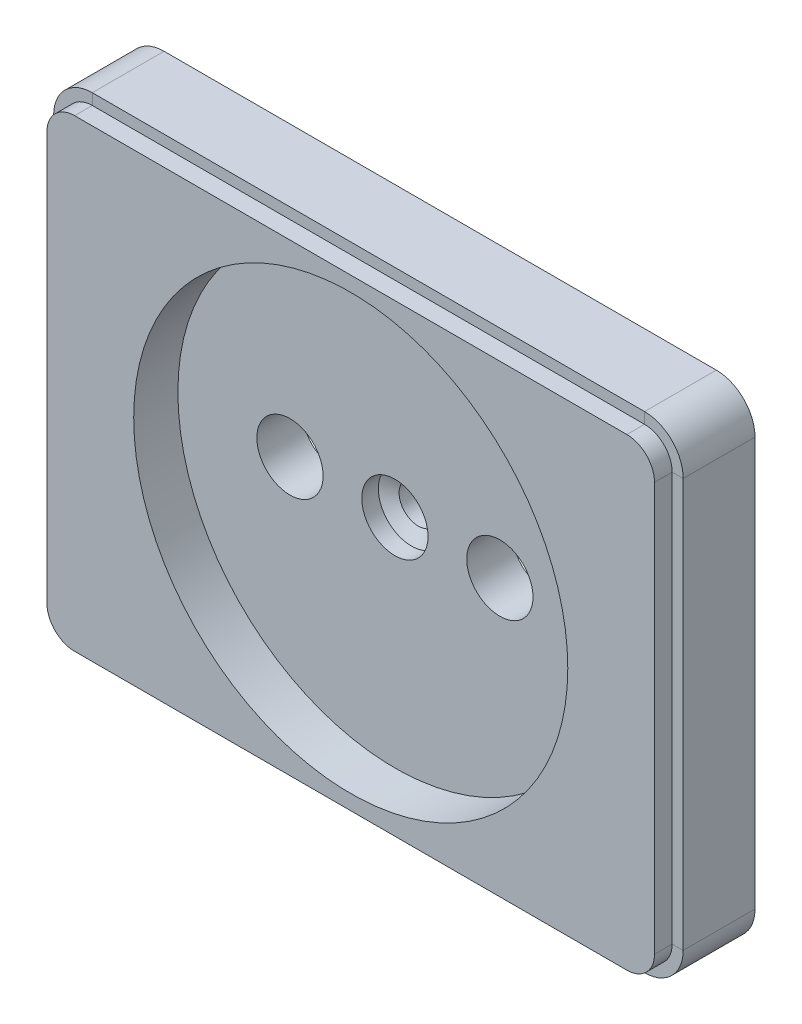
ISO-10303-21;
HEADER;
FILE_DESCRIPTION(('STEP AP214'),'2;1');
FILE_NAME('part.step','',(''),(''),'','','');
FILE_SCHEMA(('AUTOMOTIVE_DESIGN { 1 0 10303 214 1 1 1 1 }'));
ENDSEC;
DATA;
#1=APPLICATION_CONTEXT('core data for automotive mechanical design processes');
#2=APPLICATION_PROTOCOL_DEFINITION('international standard','automotive_design',2000,#1);
#3=PRODUCT_CONTEXT('',#1,'mechanical');
#4=PRODUCT('Part','Part','',(#3));
#5=PRODUCT_RELATED_PRODUCT_CATEGORY('part','',(#4));
#6=PRODUCT_DEFINITION_FORMATION('','',#4);
#7=PRODUCT_DEFINITION_CONTEXT('part definition',#1,'design');
#8=PRODUCT_DEFINITION('design','',#6,#7);
#9=PRODUCT_DEFINITION_SHAPE('','',#8);
#10=(LENGTH_UNIT() NAMED_UNIT(*) SI_UNIT(.MILLI.,.METRE.));
#11=(NAMED_UNIT(*) PLANE_ANGLE_UNIT() SI_UNIT($,.RADIAN.));
#12=(NAMED_UNIT(*) SI_UNIT($,.STERADIAN.) SOLID_ANGLE_UNIT());
#13=UNCERTAINTY_MEASURE_WITH_UNIT(LENGTH_MEASURE(1.E-05),#10,'distance_accuracy_value','');
#14=(GEOMETRIC_REPRESENTATION_CONTEXT(3) GLOBAL_UNCERTAINTY_ASSIGNED_CONTEXT((#13)) GLOBAL_UNIT_ASSIGNED_CONTEXT((#10,
#11,#12)) REPRESENTATION_CONTEXT('',''));
#15=CARTESIAN_POINT('',(0.,0.,0.));
#16=DIRECTION('',(0.,0.,1.));
#17=DIRECTION('',(1.,0.,0.));
#18=AXIS2_PLACEMENT_3D('',#15,#16,#17);
#19=CARTESIAN_POINT('',(0.,0.,8.1));
#20=DIRECTION('',(0.,0.,-1.));
#21=DIRECTION('',(-1.,0.,0.));
#22=AXIS2_PLACEMENT_3D('',#19,#20,#21);
#23=CYLINDRICAL_SURFACE('',#22,1.75);
#24=CARTESIAN_POINT('',(0.,0.,0.));
#25=DIRECTION('',(0.,0.,1.));
#26=DIRECTION('',(1.,0.,0.));
#27=AXIS2_PLACEMENT_3D('',#24,#25,#26);
#28=CIRCLE('',#27,1.75);
#29=CARTESIAN_POINT('',(1.75000000000001,0.,0.));
#30=VERTEX_POINT('',#29);
#31=EDGE_CURVE('E305',#30,#30,#28,.T.);
#32=ORIENTED_EDGE('',*,*,#31,.F.);
#33=EDGE_LOOP('',(#32));
#34=FACE_BOUND('',#33,.T.);
#35=CARTESIAN_POINT('',(0.,0.,1.975));
#36=DIRECTION('',(0.,0.,1.));
#37=DIRECTION('',(1.,0.,0.));
#38=AXIS2_PLACEMENT_3D('',#35,#36,#37);
#39=CIRCLE('',#38,1.75);
#40=CARTESIAN_POINT('',(1.75,0.,1.975));
#41=VERTEX_POINT('',#40);
#42=EDGE_CURVE('E286',#41,#41,#39,.T.);
#43=ORIENTED_EDGE('',*,*,#42,.T.);
#44=EDGE_LOOP('',(#43));
#45=FACE_BOUND('',#44,.T.);
#46=ADVANCED_FACE('F33',(#34,#45),#23,.F.);
#47=CARTESIAN_POINT('',(-9.5,0.,8.1));
#48=DIRECTION('',(0.,0.,-1.));
#49=DIRECTION('',(-1.,0.,0.));
#50=AXIS2_PLACEMENT_3D('',#47,#48,#49);
#51=CYLINDRICAL_SURFACE('',#50,3.);
#52=CARTESIAN_POINT('',(-9.5,0.,0.));
#53=DIRECTION('',(0.,0.,1.));
#54=DIRECTION('',(1.,0.,0.));
#55=AXIS2_PLACEMENT_3D('',#52,#53,#54);
#56=CIRCLE('',#55,3.);
#57=CARTESIAN_POINT('',(-6.5,0.,0.));
#58=VERTEX_POINT('',#57);
#59=EDGE_CURVE('E308',#58,#58,#56,.T.);
#60=ORIENTED_EDGE('',*,*,#59,.F.);
#61=EDGE_LOOP('',(#60));
#62=FACE_BOUND('',#61,.T.);
#63=CARTESIAN_POINT('',(-9.5,0.,4.1));
#64=DIRECTION('',(0.,0.,1.));
#65=DIRECTION('',(1.,0.,0.));
#66=AXIS2_PLACEMENT_3D('',#63,#64,#65);
#67=CIRCLE('',#66,3.);
#68=CARTESIAN_POINT('',(-6.5,0.,4.1));
#69=VERTEX_POINT('',#68);
#70=EDGE_CURVE('E299',#69,#69,#67,.T.);
#71=ORIENTED_EDGE('',*,*,#70,.T.);
#72=EDGE_LOOP('',(#71));
#73=FACE_BOUND('',#72,.T.);
#74=ADVANCED_FACE('F445',(#62,#73),#51,.F.);
#75=CARTESIAN_POINT('',(9.5,0.,8.1));
#76=DIRECTION('',(0.,0.,-1.));
#77=DIRECTION('',(-1.,0.,0.));
#78=AXIS2_PLACEMENT_3D('',#75,#76,#77);
#79=CYLINDRICAL_SURFACE('',#78,3.);
#80=CARTESIAN_POINT('',(9.5,0.,0.));
#81=DIRECTION('',(0.,0.,1.));
#82=DIRECTION('',(1.,0.,0.));
#83=AXIS2_PLACEMENT_3D('',#80,#81,#82);
#84=CIRCLE('',#83,3.);
#85=CARTESIAN_POINT('',(12.5,0.,0.));
#86=VERTEX_POINT('',#85);
#87=EDGE_CURVE('E302',#86,#86,#84,.T.);
#88=ORIENTED_EDGE('',*,*,#87,.F.);
#89=EDGE_LOOP('',(#88));
#90=FACE_BOUND('',#89,.T.);
#91=CARTESIAN_POINT('',(9.5,0.,4.1));
#92=DIRECTION('',(0.,0.,1.));
#93=DIRECTION('',(1.,0.,0.));
#94=AXIS2_PLACEMENT_3D('',#91,#92,#93);
#95=CIRCLE('',#94,3.);
#96=CARTESIAN_POINT('',(12.5,0.,4.1));
#97=VERTEX_POINT('',#96);
#98=EDGE_CURVE('E296',#97,#97,#95,.T.);
#99=ORIENTED_EDGE('',*,*,#98,.T.);
#100=EDGE_LOOP('',(#99));
#101=FACE_BOUND('',#100,.T.);
#102=ADVANCED_FACE('F451',(#90,#101),#79,.F.);
#103=CARTESIAN_POINT('',(28.5,0.,8.1));
#104=DIRECTION('',(1.,0.,0.));
#105=DIRECTION('',(0.,1.,0.));
#106=AXIS2_PLACEMENT_3D('',#103,#104,#105);
#107=PLANE('',#106);
#108=DIRECTION('',(0.,-1.,0.));
#109=VECTOR('',#108,1.);
#110=CARTESIAN_POINT('',(28.5,18.5,6.5));
#111=LINE('',#110,#109);
#112=CARTESIAN_POINT('',(28.5,18.5,6.5));
#113=VERTEX_POINT('',#112);
#114=CARTESIAN_POINT('',(28.5,-18.5,6.5));
#115=VERTEX_POINT('',#114);
#116=EDGE_CURVE('E211',#113,#115,#111,.T.);
#117=ORIENTED_EDGE('',*,*,#116,.T.);
#118=DIRECTION('',(0.,0.,-1.));
#119=VECTOR('',#118,1.);
#120=CARTESIAN_POINT('',(28.5,-18.5,0.));
#121=LINE('',#120,#119);
#122=CARTESIAN_POINT('',(28.5,-18.5,0.));
#123=VERTEX_POINT('',#122);
#124=EDGE_CURVE('E340',#115,#123,#121,.T.);
#125=ORIENTED_EDGE('',*,*,#124,.T.);
#126=DIRECTION('',(0.,-1.,0.));
#127=VECTOR('',#126,1.);
#128=CARTESIAN_POINT('',(28.5,0.,0.));
#129=LINE('',#128,#127);
#130=CARTESIAN_POINT('',(28.5,18.5,0.));
#131=VERTEX_POINT('',#130);
#132=EDGE_CURVE('E311',#131,#123,#129,.T.);
#133=ORIENTED_EDGE('',*,*,#132,.F.);
#134=DIRECTION('',(0.,0.,-1.));
#135=VECTOR('',#134,1.);
#136=CARTESIAN_POINT('',(28.5,18.5,8.1));
#137=LINE('',#136,#135);
#138=EDGE_CURVE('E342',#131,#113,#137,.F.);
#139=ORIENTED_EDGE('',*,*,#138,.T.);
#140=EDGE_LOOP('',(#117,#125,#133,#139));
#141=FACE_BOUND('',#140,.T.);
#142=ADVANCED_FACE('F385',(#141),#107,.T.);
#143=CARTESIAN_POINT('',(0.,22.,8.1));
#144=DIRECTION('',(0.,1.,0.));
#145=DIRECTION('',(0.,0.,1.));
#146=AXIS2_PLACEMENT_3D('',#143,#144,#145);
#147=PLANE('',#146);
#148=DIRECTION('',(1.,0.,0.));
#149=VECTOR('',#148,1.);
#150=CARTESIAN_POINT('',(-25.,22.,6.5));
#151=LINE('',#150,#149);
#152=CARTESIAN_POINT('',(-25.,22.,6.5));
#153=VERTEX_POINT('',#152);
#154=CARTESIAN_POINT('',(25.,22.,6.5));
#155=VERTEX_POINT('',#154);
#156=EDGE_CURVE('E202',#153,#155,#151,.T.);
#157=ORIENTED_EDGE('',*,*,#156,.T.);
#158=DIRECTION('',(0.,0.,-1.));
#159=VECTOR('',#158,1.);
#160=CARTESIAN_POINT('',(25.,22.,8.1));
#161=LINE('',#160,#159);
#162=CARTESIAN_POINT('',(25.,22.,0.));
#163=VERTEX_POINT('',#162);
#164=EDGE_CURVE('E335',#155,#163,#161,.T.);
#165=ORIENTED_EDGE('',*,*,#164,.T.);
#166=DIRECTION('',(1.,0.,0.));
#167=VECTOR('',#166,1.);
#168=CARTESIAN_POINT('',(0.,22.,0.));
#169=LINE('',#168,#167);
#170=CARTESIAN_POINT('',(-25.,22.,0.));
#171=VERTEX_POINT('',#170);
#172=EDGE_CURVE('E314',#171,#163,#169,.T.);
#173=ORIENTED_EDGE('',*,*,#172,.F.);
#174=DIRECTION('',(0.,0.,-1.));
#175=VECTOR('',#174,1.);
#176=CARTESIAN_POINT('',(-25.,22.,8.1));
#177=LINE('',#176,#175);
#178=EDGE_CURVE('E337',#171,#153,#177,.F.);
#179=ORIENTED_EDGE('',*,*,#178,.T.);
#180=EDGE_LOOP('',(#157,#165,#173,#179));
#181=FACE_BOUND('',#180,.T.);
#182=ADVANCED_FACE('F379',(#181),#147,.T.);
#183=CARTESIAN_POINT('',(-28.5,0.,8.1));
#184=DIRECTION('',(1.,0.,0.));
#185=DIRECTION('',(0.,1.,0.));
#186=AXIS2_PLACEMENT_3D('',#183,#184,#185);
#187=PLANE('',#186);
#188=DIRECTION('',(0.,0.,-1.));
#189=VECTOR('',#188,1.);
#190=CARTESIAN_POINT('',(-28.5,-18.5,8.1));
#191=LINE('',#190,#189);
#192=CARTESIAN_POINT('',(-28.5,-18.5,0.));
#193=VERTEX_POINT('',#192);
#194=CARTESIAN_POINT('',(-28.5,-18.5,6.5));
#195=VERTEX_POINT('',#194);
#196=EDGE_CURVE('E181',#193,#195,#191,.F.);
#197=ORIENTED_EDGE('',*,*,#196,.T.);
#198=DIRECTION('',(0.,1.,0.));
#199=VECTOR('',#198,1.);
#200=CARTESIAN_POINT('',(-28.5,-18.5,6.5));
#201=LINE('',#200,#199);
#202=CARTESIAN_POINT('',(-28.5,0.,6.5));
#203=VERTEX_POINT('',#202);
#204=EDGE_CURVE('E173',#195,#203,#201,.T.);
#205=ORIENTED_EDGE('',*,*,#204,.T.);
#206=DIRECTION('',(0.,1.,0.));
#207=VECTOR('',#206,1.);
#208=CARTESIAN_POINT('',(-28.5,0.,6.5));
#209=LINE('',#208,#207);
#210=CARTESIAN_POINT('',(-28.5,18.5,6.5));
#211=VERTEX_POINT('',#210);
#212=EDGE_CURVE('E159',#203,#211,#209,.T.);
#213=ORIENTED_EDGE('',*,*,#212,.T.);
#214=DIRECTION('',(0.,0.,-1.));
#215=VECTOR('',#214,1.);
#216=CARTESIAN_POINT('',(-28.5,18.5,0.));
#217=LINE('',#216,#215);
#218=CARTESIAN_POINT('',(-28.5,18.5,0.));
#219=VERTEX_POINT('',#218);
#220=EDGE_CURVE('E325',#211,#219,#217,.T.);
#221=ORIENTED_EDGE('',*,*,#220,.T.);
#222=DIRECTION('',(0.,-1.,0.));
#223=VECTOR('',#222,1.);
#224=CARTESIAN_POINT('',(-28.5,0.,0.));
#225=LINE('',#224,#223);
#226=EDGE_CURVE('E317',#219,#193,#225,.T.);
#227=ORIENTED_EDGE('',*,*,#226,.T.);
#228=EDGE_LOOP('',(#197,#205,#213,#221,#227));
#229=FACE_BOUND('',#228,.T.);
#230=ADVANCED_FACE('F178',(#229),#187,.F.);
#231=CARTESIAN_POINT('',(0.,-22.,8.1));
#232=DIRECTION('',(0.,1.,0.));
#233=DIRECTION('',(0.,0.,1.));
#234=AXIS2_PLACEMENT_3D('',#231,#232,#233);
#235=PLANE('',#234);
#236=DIRECTION('',(0.,0.,-1.));
#237=VECTOR('',#236,1.);
#238=CARTESIAN_POINT('',(25.,-22.,8.1));
#239=LINE('',#238,#237);
#240=CARTESIAN_POINT('',(25.,-22.,0.));
#241=VERTEX_POINT('',#240);
#242=CARTESIAN_POINT('',(25.,-22.,6.5));
#243=VERTEX_POINT('',#242);
#244=EDGE_CURVE('E12',#241,#243,#239,.F.);
#245=ORIENTED_EDGE('',*,*,#244,.T.);
#246=DIRECTION('',(-1.,0.,0.));
#247=VECTOR('',#246,1.);
#248=CARTESIAN_POINT('',(25.,-22.,6.5));
#249=LINE('',#248,#247);
#250=CARTESIAN_POINT('',(-25.,-22.,6.5));
#251=VERTEX_POINT('',#250);
#252=EDGE_CURVE('E221',#243,#251,#249,.T.);
#253=ORIENTED_EDGE('',*,*,#252,.T.);
#254=DIRECTION('',(0.,0.,-1.));
#255=VECTOR('',#254,1.);
#256=CARTESIAN_POINT('',(-25.,-22.,8.1));
#257=LINE('',#256,#255);
#258=CARTESIAN_POINT('',(-25.,-22.,0.));
#259=VERTEX_POINT('',#258);
#260=EDGE_CURVE('E41',#251,#259,#257,.T.);
#261=ORIENTED_EDGE('',*,*,#260,.T.);
#262=DIRECTION('',(1.,0.,0.));
#263=VECTOR('',#262,1.);
#264=CARTESIAN_POINT('',(0.,-22.,0.));
#265=LINE('',#264,#263);
#266=EDGE_CURVE('E319',#259,#241,#265,.T.);
#267=ORIENTED_EDGE('',*,*,#266,.T.);
#268=EDGE_LOOP('',(#245,#253,#261,#267));
#269=FACE_BOUND('',#268,.T.);
#270=ADVANCED_FACE('F348',(#269),#235,.F.);
#271=CARTESIAN_POINT('',(0.,0.,8.1));
#272=DIRECTION('',(0.,0.,1.));
#273=DIRECTION('',(1.,0.,0.));
#274=AXIS2_PLACEMENT_3D('',#271,#272,#273);
#275=PLANE('',#274);
#276=DIRECTION('',(0.,1.,0.));
#277=VECTOR('',#276,1.);
#278=CARTESIAN_POINT('',(-27.5,-18.5,8.1));
#279=LINE('',#278,#277);
#280=CARTESIAN_POINT('',(-27.5,-18.5,8.1));
#281=VERTEX_POINT('',#280);
#282=CARTESIAN_POINT('',(-27.5,0.,8.1));
#283=VERTEX_POINT('',#282);
#284=EDGE_CURVE('E182',#281,#283,#279,.T.);
#285=ORIENTED_EDGE('',*,*,#284,.F.);
#286=CARTESIAN_POINT('',(-25.,-18.5,8.1));
#287=DIRECTION('',(0.,0.,-1.));
#288=DIRECTION('',(0.,-1.,0.));
#289=AXIS2_PLACEMENT_3D('',#286,#287,#288);
#290=CIRCLE('',#289,2.5);
#291=CARTESIAN_POINT('',(-25.,-21.,8.1));
#292=VERTEX_POINT('',#291);
#293=EDGE_CURVE('E222',#292,#281,#290,.T.);
#294=ORIENTED_EDGE('',*,*,#293,.F.);
#295=DIRECTION('',(-1.,0.,0.));
#296=VECTOR('',#295,1.);
#297=CARTESIAN_POINT('',(25.,-21.,8.1));
#298=LINE('',#297,#296);
#299=CARTESIAN_POINT('',(25.,-21.,8.1));
#300=VERTEX_POINT('',#299);
#301=EDGE_CURVE('E217',#300,#292,#298,.T.);
#302=ORIENTED_EDGE('',*,*,#301,.F.);
#303=CARTESIAN_POINT('',(25.,-18.5,8.1));
#304=DIRECTION('',(0.,0.,-1.));
#305=DIRECTION('',(1.,0.,0.));
#306=AXIS2_PLACEMENT_3D('',#303,#304,#305);
#307=CIRCLE('',#306,2.5);
#308=CARTESIAN_POINT('',(27.5,-18.5,8.1));
#309=VERTEX_POINT('',#308);
#310=EDGE_CURVE('E212',#309,#300,#307,.T.);
#311=ORIENTED_EDGE('',*,*,#310,.F.);
#312=DIRECTION('',(0.,-1.,0.));
#313=VECTOR('',#312,1.);
#314=CARTESIAN_POINT('',(27.5,18.5,8.1));
#315=LINE('',#314,#313);
#316=CARTESIAN_POINT('',(27.5,18.5,8.1));
#317=VERTEX_POINT('',#316);
#318=EDGE_CURVE('E208',#317,#309,#315,.T.);
#319=ORIENTED_EDGE('',*,*,#318,.F.);
#320=CARTESIAN_POINT('',(25.,18.5,8.1));
#321=DIRECTION('',(0.,0.,-1.));
#322=DIRECTION('',(0.,1.,0.));
#323=AXIS2_PLACEMENT_3D('',#320,#321,#322);
#324=CIRCLE('',#323,2.5);
#325=CARTESIAN_POINT('',(25.,21.,8.1));
#326=VERTEX_POINT('',#325);
#327=EDGE_CURVE('E203',#326,#317,#324,.T.);
#328=ORIENTED_EDGE('',*,*,#327,.F.);
#329=DIRECTION('',(1.,0.,0.));
#330=VECTOR('',#329,1.);
#331=CARTESIAN_POINT('',(-25.,21.,8.1));
#332=LINE('',#331,#330);
#333=CARTESIAN_POINT('',(-25.,21.,8.1));
#334=VERTEX_POINT('',#333);
#335=EDGE_CURVE('E198',#334,#326,#332,.T.);
#336=ORIENTED_EDGE('',*,*,#335,.F.);
#337=CARTESIAN_POINT('',(-25.,18.5,8.1));
#338=DIRECTION('',(0.,0.,-1.));
#339=DIRECTION('',(-1.,0.,0.));
#340=AXIS2_PLACEMENT_3D('',#337,#338,#339);
#341=CIRCLE('',#340,2.5);
#342=CARTESIAN_POINT('',(-27.5,18.5,8.1));
#343=VERTEX_POINT('',#342);
#344=EDGE_CURVE('E193',#343,#334,#341,.T.);
#345=ORIENTED_EDGE('',*,*,#344,.F.);
#346=DIRECTION('',(0.,1.,0.));
#347=VECTOR('',#346,1.);
#348=CARTESIAN_POINT('',(-27.5,0.,8.1));
#349=LINE('',#348,#347);
#350=EDGE_CURVE('E169',#283,#343,#349,.T.);
#351=ORIENTED_EDGE('',*,*,#350,.F.);
#352=EDGE_LOOP('',(#285,#294,#302,#311,#319,#328,#336,#345,#351));
#353=FACE_BOUND('',#352,.T.);
#354=CARTESIAN_POINT('',(0.,0.,8.1));
#355=DIRECTION('',(0.,0.,1.));
#356=DIRECTION('',(1.,0.,0.));
#357=AXIS2_PLACEMENT_3D('',#354,#355,#356);
#358=CIRCLE('',#357,19.65);
#359=CARTESIAN_POINT('',(19.65,0.,8.1));
#360=VERTEX_POINT('',#359);
#361=EDGE_CURVE('E292',#360,#360,#358,.T.);
#362=ORIENTED_EDGE('',*,*,#361,.F.);
#363=EDGE_LOOP('',(#362));
#364=FACE_BOUND('',#363,.T.);
#365=ADVANCED_FACE('F428',(#353,#364),#275,.T.);
#366=CARTESIAN_POINT('',(0.,0.,0.));
#367=DIRECTION('',(0.,0.,1.));
#368=DIRECTION('',(1.,0.,0.));
#369=AXIS2_PLACEMENT_3D('',#366,#367,#368);
#370=PLANE('',#369);
#371=ORIENTED_EDGE('',*,*,#87,.T.);
#372=EDGE_LOOP('',(#371));
#373=FACE_BOUND('',#372,.T.);
#374=ORIENTED_EDGE('',*,*,#31,.T.);
#375=EDGE_LOOP('',(#374));
#376=FACE_BOUND('',#375,.T.);
#377=ORIENTED_EDGE('',*,*,#59,.T.);
#378=EDGE_LOOP('',(#377));
#379=FACE_BOUND('',#378,.T.);
#380=ORIENTED_EDGE('',*,*,#226,.F.);
#381=CARTESIAN_POINT('',(-25.,18.5,0.));
#382=DIRECTION('',(0.,0.,1.));
#383=DIRECTION('',(1.,0.,0.));
#384=AXIS2_PLACEMENT_3D('',#381,#382,#383);
#385=CIRCLE('',#384,3.5);
#386=EDGE_CURVE('E333',#219,#171,#385,.F.);
#387=ORIENTED_EDGE('',*,*,#386,.T.);
#388=ORIENTED_EDGE('',*,*,#172,.T.);
#389=CARTESIAN_POINT('',(25.,18.5,0.));
#390=DIRECTION('',(0.,0.,1.));
#391=DIRECTION('',(1.,0.,0.));
#392=AXIS2_PLACEMENT_3D('',#389,#390,#391);
#393=CIRCLE('',#392,3.5);
#394=EDGE_CURVE('E331',#163,#131,#393,.F.);
#395=ORIENTED_EDGE('',*,*,#394,.T.);
#396=ORIENTED_EDGE('',*,*,#132,.T.);
#397=CARTESIAN_POINT('',(25.,-18.5,0.));
#398=DIRECTION('',(0.,0.,1.));
#399=DIRECTION('',(1.,0.,0.));
#400=AXIS2_PLACEMENT_3D('',#397,#398,#399);
#401=CIRCLE('',#400,3.5);
#402=EDGE_CURVE('E329',#123,#241,#401,.F.);
#403=ORIENTED_EDGE('',*,*,#402,.T.);
#404=ORIENTED_EDGE('',*,*,#266,.F.);
#405=CARTESIAN_POINT('',(-25.,-18.5,0.));
#406=DIRECTION('',(0.,0.,1.));
#407=DIRECTION('',(1.,0.,0.));
#408=AXIS2_PLACEMENT_3D('',#405,#406,#407);
#409=CIRCLE('',#408,3.5);
#410=EDGE_CURVE('E327',#259,#193,#409,.F.);
#411=ORIENTED_EDGE('',*,*,#410,.T.);
#412=EDGE_LOOP('',(#380,#387,#388,#395,#396,#403,#404,#411));
#413=FACE_BOUND('',#412,.T.);
#414=ADVANCED_FACE('F354',(#373,#376,#379,#413),#370,.F.);
#415=CARTESIAN_POINT('',(0.,0.,4.1));
#416=DIRECTION('',(0.,0.,1.));
#417=DIRECTION('',(1.,0.,0.));
#418=AXIS2_PLACEMENT_3D('',#415,#416,#417);
#419=CYLINDRICAL_SURFACE('',#418,19.65);
#420=CARTESIAN_POINT('',(0.,0.,4.1));
#421=DIRECTION('',(0.,0.,1.));
#422=DIRECTION('',(1.,0.,0.));
#423=AXIS2_PLACEMENT_3D('',#420,#421,#422);
#424=CIRCLE('',#423,19.65);
#425=CARTESIAN_POINT('',(19.65,0.,4.1));
#426=VERTEX_POINT('',#425);
#427=EDGE_CURVE('E293',#426,#426,#424,.T.);
#428=ORIENTED_EDGE('',*,*,#427,.F.);
#429=EDGE_LOOP('',(#428));
#430=FACE_BOUND('',#429,.T.);
#431=ORIENTED_EDGE('',*,*,#361,.T.);
#432=EDGE_LOOP('',(#431));
#433=FACE_BOUND('',#432,.T.);
#434=ADVANCED_FACE('F490',(#430,#433),#419,.F.);
#435=CARTESIAN_POINT('',(0.,0.,4.1));
#436=DIRECTION('',(0.,0.,1.));
#437=DIRECTION('',(1.,0.,0.));
#438=AXIS2_PLACEMENT_3D('',#435,#436,#437);
#439=PLANE('',#438);
#440=CARTESIAN_POINT('',(0.,0.,4.1));
#441=DIRECTION('',(0.,0.,1.));
#442=DIRECTION('',(1.,0.,0.));
#443=AXIS2_PLACEMENT_3D('',#440,#441,#442);
#444=CIRCLE('',#443,3.);
#445=CARTESIAN_POINT('',(3.00000000000001,0.,4.1));
#446=VERTEX_POINT('',#445);
#447=EDGE_CURVE('E289',#446,#446,#444,.T.);
#448=ORIENTED_EDGE('',*,*,#447,.F.);
#449=EDGE_LOOP('',(#448));
#450=FACE_BOUND('',#449,.T.);
#451=ORIENTED_EDGE('',*,*,#70,.F.);
#452=EDGE_LOOP('',(#451));
#453=FACE_BOUND('',#452,.T.);
#454=ORIENTED_EDGE('',*,*,#98,.F.);
#455=EDGE_LOOP('',(#454));
#456=FACE_BOUND('',#455,.T.);
#457=ORIENTED_EDGE('',*,*,#427,.T.);
#458=EDGE_LOOP('',(#457));
#459=FACE_BOUND('',#458,.T.);
#460=ADVANCED_FACE('F486',(#450,#453,#456,#459),#439,.T.);
#461=CARTESIAN_POINT('',(0.,0.,2.6));
#462=DIRECTION('',(0.,0.,1.));
#463=DIRECTION('',(1.,0.,0.));
#464=AXIS2_PLACEMENT_3D('',#461,#462,#463);
#465=CYLINDRICAL_SURFACE('',#464,3.);
#466=CARTESIAN_POINT('',(0.,0.,2.6));
#467=DIRECTION('',(0.,0.,1.));
#468=DIRECTION('',(1.,0.,0.));
#469=AXIS2_PLACEMENT_3D('',#466,#467,#468);
#470=CIRCLE('',#469,3.00000000000001);
#471=CARTESIAN_POINT('',(3.00000000000001,0.,2.6));
#472=VERTEX_POINT('',#471);
#473=EDGE_CURVE('E269',#472,#472,#470,.T.);
#474=ORIENTED_EDGE('',*,*,#473,.F.);
#475=EDGE_LOOP('',(#474));
#476=FACE_BOUND('',#475,.T.);
#477=ORIENTED_EDGE('',*,*,#447,.T.);
#478=EDGE_LOOP('',(#477));
#479=FACE_BOUND('',#478,.T.);
#480=ADVANCED_FACE('F482',(#476,#479),#465,.F.);
#481=CARTESIAN_POINT('',(0.,0.,1.1));
#482=DIRECTION('',(0.,0.,1.));
#483=DIRECTION('',(1.,0.,0.));
#484=AXIS2_PLACEMENT_3D('',#481,#482,#483);
#485=CONICAL_SURFACE('',#484,0.,1.10714871779409);
#486=ORIENTED_EDGE('',*,*,#42,.F.);
#487=EDGE_LOOP('',(#486));
#488=FACE_BOUND('',#487,.T.);
#489=ORIENTED_EDGE('',*,*,#473,.T.);
#490=EDGE_LOOP('',(#489));
#491=FACE_BOUND('',#490,.T.);
#492=ADVANCED_FACE('F463',(#488,#491),#485,.F.);
#493=CARTESIAN_POINT('',(-25.,18.5,8.1));
#494=DIRECTION('',(0.,0.,1.));
#495=DIRECTION('',(1.,0.,0.));
#496=AXIS2_PLACEMENT_3D('',#493,#494,#495);
#497=CYLINDRICAL_SURFACE('',#496,3.5);
#498=CARTESIAN_POINT('',(-25.,18.5,6.5));
#499=DIRECTION('',(0.,0.,-1.));
#500=DIRECTION('',(-1.,0.,0.));
#501=AXIS2_PLACEMENT_3D('',#498,#499,#500);
#502=CIRCLE('',#501,3.5);
#503=EDGE_CURVE('E197',#211,#153,#502,.T.);
#504=ORIENTED_EDGE('',*,*,#503,.T.);
#505=ORIENTED_EDGE('',*,*,#178,.F.);
#506=ORIENTED_EDGE('',*,*,#386,.F.);
#507=ORIENTED_EDGE('',*,*,#220,.F.);
#508=EDGE_LOOP('',(#504,#505,#506,#507));
#509=FACE_BOUND('',#508,.T.);
#510=ADVANCED_FACE('F374',(#509),#497,.T.);
#511=CARTESIAN_POINT('',(25.,18.5,8.1));
#512=DIRECTION('',(0.,0.,-1.));
#513=DIRECTION('',(-1.,0.,0.));
#514=AXIS2_PLACEMENT_3D('',#511,#512,#513);
#515=CYLINDRICAL_SURFACE('',#514,3.5);
#516=CARTESIAN_POINT('',(25.,18.5,6.5));
#517=DIRECTION('',(0.,0.,-1.));
#518=DIRECTION('',(0.,1.,0.));
#519=AXIS2_PLACEMENT_3D('',#516,#517,#518);
#520=CIRCLE('',#519,3.5);
#521=EDGE_CURVE('E207',#155,#113,#520,.T.);
#522=ORIENTED_EDGE('',*,*,#521,.T.);
#523=ORIENTED_EDGE('',*,*,#138,.F.);
#524=ORIENTED_EDGE('',*,*,#394,.F.);
#525=ORIENTED_EDGE('',*,*,#164,.F.);
#526=EDGE_LOOP('',(#522,#523,#524,#525));
#527=FACE_BOUND('',#526,.T.);
#528=ADVANCED_FACE('F386',(#527),#515,.T.);
#529=CARTESIAN_POINT('',(25.,-18.5,8.1));
#530=DIRECTION('',(0.,0.,1.));
#531=DIRECTION('',(1.,0.,0.));
#532=AXIS2_PLACEMENT_3D('',#529,#530,#531);
#533=CYLINDRICAL_SURFACE('',#532,3.5);
#534=CARTESIAN_POINT('',(25.,-18.5,6.5));
#535=DIRECTION('',(0.,0.,-1.));
#536=DIRECTION('',(1.,0.,0.));
#537=AXIS2_PLACEMENT_3D('',#534,#535,#536);
#538=CIRCLE('',#537,3.5);
#539=EDGE_CURVE('E216',#115,#243,#538,.T.);
#540=ORIENTED_EDGE('',*,*,#539,.T.);
#541=ORIENTED_EDGE('',*,*,#244,.F.);
#542=ORIENTED_EDGE('',*,*,#402,.F.);
#543=ORIENTED_EDGE('',*,*,#124,.F.);
#544=EDGE_LOOP('',(#540,#541,#542,#543));
#545=FACE_BOUND('',#544,.T.);
#546=ADVANCED_FACE('F360',(#545),#533,.T.);
#547=CARTESIAN_POINT('',(-25.,-18.5,8.1));
#548=DIRECTION('',(0.,0.,-1.));
#549=DIRECTION('',(-1.,0.,0.));
#550=AXIS2_PLACEMENT_3D('',#547,#548,#549);
#551=CYLINDRICAL_SURFACE('',#550,3.5);
#552=CARTESIAN_POINT('',(-25.,-18.5,6.5));
#553=DIRECTION('',(0.,0.,-1.));
#554=DIRECTION('',(0.,-1.,0.));
#555=AXIS2_PLACEMENT_3D('',#552,#553,#554);
#556=CIRCLE('',#555,3.5);
#557=EDGE_CURVE('E189',#251,#195,#556,.T.);
#558=ORIENTED_EDGE('',*,*,#557,.T.);
#559=ORIENTED_EDGE('',*,*,#196,.F.);
#560=ORIENTED_EDGE('',*,*,#410,.F.);
#561=ORIENTED_EDGE('',*,*,#260,.F.);
#562=EDGE_LOOP('',(#558,#559,#560,#561));
#563=FACE_BOUND('',#562,.T.);
#564=ADVANCED_FACE('F35',(#563),#551,.T.);
#565=CARTESIAN_POINT('',(-27.5,-18.5,6.5));
#566=DIRECTION('',(0.,0.,-1.));
#567=DIRECTION('',(-1.,0.,0.));
#568=AXIS2_PLACEMENT_3D('',#565,#566,#567);
#569=PLANE('',#568);
#570=DIRECTION('',(0.,1.,0.));
#571=VECTOR('',#570,1.);
#572=CARTESIAN_POINT('',(-27.5,-18.5,6.5));
#573=LINE('',#572,#571);
#574=CARTESIAN_POINT('',(-27.5,-18.5,6.5));
#575=VERTEX_POINT('',#574);
#576=CARTESIAN_POINT('',(-27.5,0.,6.5));
#577=VERTEX_POINT('',#576);
#578=EDGE_CURVE('E175',#575,#577,#573,.T.);
#579=ORIENTED_EDGE('',*,*,#578,.T.);
#580=DIRECTION('',(-1.,0.,0.));
#581=VECTOR('',#580,1.);
#582=CARTESIAN_POINT('',(-27.5,0.,6.5));
#583=LINE('',#582,#581);
#584=EDGE_CURVE('E163',#577,#203,#583,.T.);
#585=ORIENTED_EDGE('',*,*,#584,.T.);
#586=ORIENTED_EDGE('',*,*,#204,.F.);
#587=DIRECTION('',(-1.,0.,0.));
#588=VECTOR('',#587,1.);
#589=CARTESIAN_POINT('',(-27.5,-18.5,6.5));
#590=LINE('',#589,#588);
#591=EDGE_CURVE('E56',#575,#195,#590,.T.);
#592=ORIENTED_EDGE('',*,*,#591,.F.);
#593=EDGE_LOOP('',(#579,#585,#586,#592));
#594=FACE_BOUND('',#593,.T.);
#595=ADVANCED_FACE('F172',(#594),#569,.F.);
#596=CARTESIAN_POINT('',(-27.5,-18.5,8.1));
#597=DIRECTION('',(1.,0.,0.));
#598=DIRECTION('',(0.,0.,-1.));
#599=AXIS2_PLACEMENT_3D('',#596,#597,#598);
#600=PLANE('',#599);
#601=ORIENTED_EDGE('',*,*,#284,.T.);
#602=DIRECTION('',(0.,0.,-1.));
#603=VECTOR('',#602,1.);
#604=CARTESIAN_POINT('',(-27.5,0.,8.1));
#605=LINE('',#604,#603);
#606=EDGE_CURVE('E48',#283,#577,#605,.T.);
#607=ORIENTED_EDGE('',*,*,#606,.T.);
#608=ORIENTED_EDGE('',*,*,#578,.F.);
#609=DIRECTION('',(0.,0.,-1.));
#610=VECTOR('',#609,1.);
#611=CARTESIAN_POINT('',(-27.5,-18.5,8.1));
#612=LINE('',#611,#610);
#613=EDGE_CURVE('E224',#281,#575,#612,.T.);
#614=ORIENTED_EDGE('',*,*,#613,.F.);
#615=EDGE_LOOP('',(#601,#607,#608,#614));
#616=FACE_BOUND('',#615,.T.);
#617=ADVANCED_FACE('F424',(#616),#600,.F.);
#618=CARTESIAN_POINT('',(-25.,-21.,6.5));
#619=DIRECTION('',(0.,0.,-1.));
#620=DIRECTION('',(-1.,0.,0.));
#621=AXIS2_PLACEMENT_3D('',#618,#619,#620);
#622=PLANE('',#621);
#623=ORIENTED_EDGE('',*,*,#591,.T.);
#624=ORIENTED_EDGE('',*,*,#557,.F.);
#625=DIRECTION('',(0.,-1.,0.));
#626=VECTOR('',#625,1.);
#627=CARTESIAN_POINT('',(-25.,-21.,6.5));
#628=LINE('',#627,#626);
#629=CARTESIAN_POINT('',(-25.,-21.,6.5));
#630=VERTEX_POINT('',#629);
#631=EDGE_CURVE('E265',#630,#251,#628,.T.);
#632=ORIENTED_EDGE('',*,*,#631,.F.);
#633=CARTESIAN_POINT('',(-25.,-18.5,6.5));
#634=DIRECTION('',(0.,0.,-1.));
#635=DIRECTION('',(0.,-1.,0.));
#636=AXIS2_PLACEMENT_3D('',#633,#634,#635);
#637=CIRCLE('',#636,2.5);
#638=EDGE_CURVE('E185',#630,#575,#637,.T.);
#639=ORIENTED_EDGE('',*,*,#638,.T.);
#640=EDGE_LOOP('',(#623,#624,#632,#639));
#641=FACE_BOUND('',#640,.T.);
#642=ADVANCED_FACE('F419',(#641),#622,.F.);
#643=CARTESIAN_POINT('',(-25.,-18.5,8.1));
#644=DIRECTION('',(0.,0.,-1.));
#645=DIRECTION('',(-1.,0.,0.));
#646=AXIS2_PLACEMENT_3D('',#643,#644,#645);
#647=CYLINDRICAL_SURFACE('',#646,2.5);
#648=ORIENTED_EDGE('',*,*,#638,.F.);
#649=DIRECTION('',(0.,0.,-1.));
#650=VECTOR('',#649,1.);
#651=CARTESIAN_POINT('',(-25.,-21.,8.1));
#652=LINE('',#651,#650);
#653=EDGE_CURVE('E220',#292,#630,#652,.T.);
#654=ORIENTED_EDGE('',*,*,#653,.F.);
#655=ORIENTED_EDGE('',*,*,#293,.T.);
#656=ORIENTED_EDGE('',*,*,#613,.T.);
#657=EDGE_LOOP('',(#648,#654,#655,#656));
#658=FACE_BOUND('',#657,.T.);
#659=ADVANCED_FACE('F421',(#658),#647,.T.);
#660=CARTESIAN_POINT('',(25.,-21.,6.5));
#661=DIRECTION('',(0.,0.,-1.));
#662=DIRECTION('',(-1.,0.,0.));
#663=AXIS2_PLACEMENT_3D('',#660,#661,#662);
#664=PLANE('',#663);
#665=ORIENTED_EDGE('',*,*,#631,.T.);
#666=ORIENTED_EDGE('',*,*,#252,.F.);
#667=DIRECTION('',(0.,-1.,0.));
#668=VECTOR('',#667,1.);
#669=CARTESIAN_POINT('',(25.,-21.,6.5));
#670=LINE('',#669,#668);
#671=CARTESIAN_POINT('',(25.,-21.,6.5));
#672=VERTEX_POINT('',#671);
#673=EDGE_CURVE('E259',#672,#243,#670,.T.);
#674=ORIENTED_EDGE('',*,*,#673,.F.);
#675=DIRECTION('',(-1.,0.,0.));
#676=VECTOR('',#675,1.);
#677=CARTESIAN_POINT('',(25.,-21.,6.5));
#678=LINE('',#677,#676);
#679=EDGE_CURVE('E262',#672,#630,#678,.T.);
#680=ORIENTED_EDGE('',*,*,#679,.T.);
#681=EDGE_LOOP('',(#665,#666,#674,#680));
#682=FACE_BOUND('',#681,.T.);
#683=ADVANCED_FACE('F417',(#682),#664,.F.);
#684=CARTESIAN_POINT('',(25.,-21.,8.1));
#685=DIRECTION('',(0.,1.,0.));
#686=DIRECTION('',(0.,0.,1.));
#687=AXIS2_PLACEMENT_3D('',#684,#685,#686);
#688=PLANE('',#687);
#689=ORIENTED_EDGE('',*,*,#679,.F.);
#690=DIRECTION('',(0.,0.,-1.));
#691=VECTOR('',#690,1.);
#692=CARTESIAN_POINT('',(25.,-21.,8.1));
#693=LINE('',#692,#691);
#694=EDGE_CURVE('E215',#300,#672,#693,.T.);
#695=ORIENTED_EDGE('',*,*,#694,.F.);
#696=ORIENTED_EDGE('',*,*,#301,.T.);
#697=ORIENTED_EDGE('',*,*,#653,.T.);
#698=EDGE_LOOP('',(#689,#695,#696,#697));
#699=FACE_BOUND('',#698,.T.);
#700=ADVANCED_FACE('F414',(#699),#688,.F.);
#701=CARTESIAN_POINT('',(27.5,-18.5,6.5));
#702=DIRECTION('',(0.,0.,-1.));
#703=DIRECTION('',(-1.,0.,0.));
#704=AXIS2_PLACEMENT_3D('',#701,#702,#703);
#705=PLANE('',#704);
#706=ORIENTED_EDGE('',*,*,#673,.T.);
#707=ORIENTED_EDGE('',*,*,#539,.F.);
#708=DIRECTION('',(1.,0.,0.));
#709=VECTOR('',#708,1.);
#710=CARTESIAN_POINT('',(27.5,-18.5,6.5));
#711=LINE('',#710,#709);
#712=CARTESIAN_POINT('',(27.5,-18.5,6.5));
#713=VERTEX_POINT('',#712);
#714=EDGE_CURVE('E252',#713,#115,#711,.T.);
#715=ORIENTED_EDGE('',*,*,#714,.F.);
#716=CARTESIAN_POINT('',(25.,-18.5,6.5));
#717=DIRECTION('',(0.,0.,-1.));
#718=DIRECTION('',(1.,0.,0.));
#719=AXIS2_PLACEMENT_3D('',#716,#717,#718);
#720=CIRCLE('',#719,2.5);
#721=EDGE_CURVE('E256',#713,#672,#720,.T.);
#722=ORIENTED_EDGE('',*,*,#721,.T.);
#723=EDGE_LOOP('',(#706,#707,#715,#722));
#724=FACE_BOUND('',#723,.T.);
#725=ADVANCED_FACE('F407',(#724),#705,.F.);
#726=CARTESIAN_POINT('',(25.,-18.5,8.1));
#727=DIRECTION('',(0.,0.,-1.));
#728=DIRECTION('',(-1.,0.,0.));
#729=AXIS2_PLACEMENT_3D('',#726,#727,#728);
#730=CYLINDRICAL_SURFACE('',#729,2.5);
#731=ORIENTED_EDGE('',*,*,#721,.F.);
#732=DIRECTION('',(0.,0.,-1.));
#733=VECTOR('',#732,1.);
#734=CARTESIAN_POINT('',(27.5,-18.5,8.1));
#735=LINE('',#734,#733);
#736=EDGE_CURVE('E249',#309,#713,#735,.T.);
#737=ORIENTED_EDGE('',*,*,#736,.F.);
#738=ORIENTED_EDGE('',*,*,#310,.T.);
#739=ORIENTED_EDGE('',*,*,#694,.T.);
#740=EDGE_LOOP('',(#731,#737,#738,#739));
#741=FACE_BOUND('',#740,.T.);
#742=ADVANCED_FACE('F410',(#741),#730,.T.);
#743=CARTESIAN_POINT('',(27.5,18.5,6.5));
#744=DIRECTION('',(0.,0.,-1.));
#745=DIRECTION('',(-1.,0.,0.));
#746=AXIS2_PLACEMENT_3D('',#743,#744,#745);
#747=PLANE('',#746);
#748=ORIENTED_EDGE('',*,*,#714,.T.);
#749=ORIENTED_EDGE('',*,*,#116,.F.);
#750=DIRECTION('',(1.,0.,0.));
#751=VECTOR('',#750,1.);
#752=CARTESIAN_POINT('',(27.5,18.5,6.5));
#753=LINE('',#752,#751);
#754=CARTESIAN_POINT('',(27.5,18.5,6.5));
#755=VERTEX_POINT('',#754);
#756=EDGE_CURVE('E248',#755,#113,#753,.T.);
#757=ORIENTED_EDGE('',*,*,#756,.F.);
#758=DIRECTION('',(0.,-1.,0.));
#759=VECTOR('',#758,1.);
#760=CARTESIAN_POINT('',(27.5,18.5,6.5));
#761=LINE('',#760,#759);
#762=EDGE_CURVE('E210',#755,#713,#761,.T.);
#763=ORIENTED_EDGE('',*,*,#762,.T.);
#764=EDGE_LOOP('',(#748,#749,#757,#763));
#765=FACE_BOUND('',#764,.T.);
#766=ADVANCED_FACE('F406',(#765),#747,.F.);
#767=CARTESIAN_POINT('',(27.5,18.5,8.1));
#768=DIRECTION('',(-1.,0.,0.));
#769=DIRECTION('',(0.,0.,1.));
#770=AXIS2_PLACEMENT_3D('',#767,#768,#769);
#771=PLANE('',#770);
#772=ORIENTED_EDGE('',*,*,#762,.F.);
#773=DIRECTION('',(0.,0.,-1.));
#774=VECTOR('',#773,1.);
#775=CARTESIAN_POINT('',(27.5,18.5,8.1));
#776=LINE('',#775,#774);
#777=EDGE_CURVE('E206',#317,#755,#776,.T.);
#778=ORIENTED_EDGE('',*,*,#777,.F.);
#779=ORIENTED_EDGE('',*,*,#318,.T.);
#780=ORIENTED_EDGE('',*,*,#736,.T.);
#781=EDGE_LOOP('',(#772,#778,#779,#780));
#782=FACE_BOUND('',#781,.T.);
#783=ADVANCED_FACE('F402',(#782),#771,.F.);
#784=CARTESIAN_POINT('',(25.,21.,6.5));
#785=DIRECTION('',(0.,0.,-1.));
#786=DIRECTION('',(-1.,0.,0.));
#787=AXIS2_PLACEMENT_3D('',#784,#785,#786);
#788=PLANE('',#787);
#789=ORIENTED_EDGE('',*,*,#756,.T.);
#790=ORIENTED_EDGE('',*,*,#521,.F.);
#791=DIRECTION('',(0.,1.,0.));
#792=VECTOR('',#791,1.);
#793=CARTESIAN_POINT('',(25.,21.,6.5));
#794=LINE('',#793,#792);
#795=CARTESIAN_POINT('',(25.,21.,6.5));
#796=VERTEX_POINT('',#795);
#797=EDGE_CURVE('E242',#796,#155,#794,.T.);
#798=ORIENTED_EDGE('',*,*,#797,.F.);
#799=CARTESIAN_POINT('',(25.,18.5,6.5));
#800=DIRECTION('',(0.,0.,-1.));
#801=DIRECTION('',(0.,1.,0.));
#802=AXIS2_PLACEMENT_3D('',#799,#800,#801);
#803=CIRCLE('',#802,2.5);
#804=EDGE_CURVE('E245',#796,#755,#803,.T.);
#805=ORIENTED_EDGE('',*,*,#804,.T.);
#806=EDGE_LOOP('',(#789,#790,#798,#805));
#807=FACE_BOUND('',#806,.T.);
#808=ADVANCED_FACE('F389',(#807),#788,.F.);
#809=CARTESIAN_POINT('',(25.,18.5,8.1));
#810=DIRECTION('',(0.,0.,-1.));
#811=DIRECTION('',(-1.,0.,0.));
#812=AXIS2_PLACEMENT_3D('',#809,#810,#811);
#813=CYLINDRICAL_SURFACE('',#812,2.5);
#814=ORIENTED_EDGE('',*,*,#804,.F.);
#815=DIRECTION('',(0.,0.,-1.));
#816=VECTOR('',#815,1.);
#817=CARTESIAN_POINT('',(25.,21.,8.1));
#818=LINE('',#817,#816);
#819=EDGE_CURVE('E201',#326,#796,#818,.T.);
#820=ORIENTED_EDGE('',*,*,#819,.F.);
#821=ORIENTED_EDGE('',*,*,#327,.T.);
#822=ORIENTED_EDGE('',*,*,#777,.T.);
#823=EDGE_LOOP('',(#814,#820,#821,#822));
#824=FACE_BOUND('',#823,.T.);
#825=ADVANCED_FACE('F399',(#824),#813,.T.);
#826=CARTESIAN_POINT('',(-25.,21.,6.5));
#827=DIRECTION('',(0.,0.,-1.));
#828=DIRECTION('',(-1.,0.,0.));
#829=AXIS2_PLACEMENT_3D('',#826,#827,#828);
#830=PLANE('',#829);
#831=ORIENTED_EDGE('',*,*,#797,.T.);
#832=ORIENTED_EDGE('',*,*,#156,.F.);
#833=DIRECTION('',(0.,1.,0.));
#834=VECTOR('',#833,1.);
#835=CARTESIAN_POINT('',(-25.,21.,6.5));
#836=LINE('',#835,#834);
#837=CARTESIAN_POINT('',(-25.,21.,6.5));
#838=VERTEX_POINT('',#837);
#839=EDGE_CURVE('E236',#838,#153,#836,.T.);
#840=ORIENTED_EDGE('',*,*,#839,.F.);
#841=DIRECTION('',(1.,0.,0.));
#842=VECTOR('',#841,1.);
#843=CARTESIAN_POINT('',(-25.,21.,6.5));
#844=LINE('',#843,#842);
#845=EDGE_CURVE('E239',#838,#796,#844,.T.);
#846=ORIENTED_EDGE('',*,*,#845,.T.);
#847=EDGE_LOOP('',(#831,#832,#840,#846));
#848=FACE_BOUND('',#847,.T.);
#849=ADVANCED_FACE('F392',(#848),#830,.F.);
#850=CARTESIAN_POINT('',(-25.,21.,8.1));
#851=DIRECTION('',(0.,-1.,0.));
#852=DIRECTION('',(0.,0.,-1.));
#853=AXIS2_PLACEMENT_3D('',#850,#851,#852);
#854=PLANE('',#853);
#855=ORIENTED_EDGE('',*,*,#845,.F.);
#856=DIRECTION('',(0.,0.,-1.));
#857=VECTOR('',#856,1.);
#858=CARTESIAN_POINT('',(-25.,21.,8.1));
#859=LINE('',#858,#857);
#860=EDGE_CURVE('E196',#334,#838,#859,.T.);
#861=ORIENTED_EDGE('',*,*,#860,.F.);
#862=ORIENTED_EDGE('',*,*,#335,.T.);
#863=ORIENTED_EDGE('',*,*,#819,.T.);
#864=EDGE_LOOP('',(#855,#861,#862,#863));
#865=FACE_BOUND('',#864,.T.);
#866=ADVANCED_FACE('F395',(#865),#854,.F.);
#867=CARTESIAN_POINT('',(-27.5,18.5,6.5));
#868=DIRECTION('',(0.,0.,-1.));
#869=DIRECTION('',(-1.,0.,0.));
#870=AXIS2_PLACEMENT_3D('',#867,#868,#869);
#871=PLANE('',#870);
#872=ORIENTED_EDGE('',*,*,#839,.T.);
#873=ORIENTED_EDGE('',*,*,#503,.F.);
#874=DIRECTION('',(-1.,0.,0.));
#875=VECTOR('',#874,1.);
#876=CARTESIAN_POINT('',(-27.5,18.5,6.5));
#877=LINE('',#876,#875);
#878=CARTESIAN_POINT('',(-27.5,18.5,6.5));
#879=VERTEX_POINT('',#878);
#880=EDGE_CURVE('E165',#879,#211,#877,.T.);
#881=ORIENTED_EDGE('',*,*,#880,.F.);
#882=CARTESIAN_POINT('',(-25.,18.5,6.5));
#883=DIRECTION('',(0.,0.,-1.));
#884=DIRECTION('',(-1.,0.,0.));
#885=AXIS2_PLACEMENT_3D('',#882,#883,#884);
#886=CIRCLE('',#885,2.5);
#887=EDGE_CURVE('E233',#879,#838,#886,.T.);
#888=ORIENTED_EDGE('',*,*,#887,.T.);
#889=EDGE_LOOP('',(#872,#873,#881,#888));
#890=FACE_BOUND('',#889,.T.);
#891=ADVANCED_FACE('F433',(#890),#871,.F.);
#892=CARTESIAN_POINT('',(-25.,18.5,8.1));
#893=DIRECTION('',(0.,0.,-1.));
#894=DIRECTION('',(-1.,0.,0.));
#895=AXIS2_PLACEMENT_3D('',#892,#893,#894);
#896=CYLINDRICAL_SURFACE('',#895,2.5);
#897=ORIENTED_EDGE('',*,*,#887,.F.);
#898=DIRECTION('',(0.,0.,-1.));
#899=VECTOR('',#898,1.);
#900=CARTESIAN_POINT('',(-27.5,18.5,8.1));
#901=LINE('',#900,#899);
#902=EDGE_CURVE('E192',#343,#879,#901,.T.);
#903=ORIENTED_EDGE('',*,*,#902,.F.);
#904=ORIENTED_EDGE('',*,*,#344,.T.);
#905=ORIENTED_EDGE('',*,*,#860,.T.);
#906=EDGE_LOOP('',(#897,#903,#904,#905));
#907=FACE_BOUND('',#906,.T.);
#908=ADVANCED_FACE('F432',(#907),#896,.T.);
#909=CARTESIAN_POINT('',(-27.5,0.,6.5));
#910=DIRECTION('',(0.,0.,-1.));
#911=DIRECTION('',(-1.,0.,0.));
#912=AXIS2_PLACEMENT_3D('',#909,#910,#911);
#913=PLANE('',#912);
#914=ORIENTED_EDGE('',*,*,#880,.T.);
#915=ORIENTED_EDGE('',*,*,#212,.F.);
#916=ORIENTED_EDGE('',*,*,#584,.F.);
#917=DIRECTION('',(0.,1.,0.));
#918=VECTOR('',#917,1.);
#919=CARTESIAN_POINT('',(-27.5,0.,6.5));
#920=LINE('',#919,#918);
#921=EDGE_CURVE('E229',#577,#879,#920,.T.);
#922=ORIENTED_EDGE('',*,*,#921,.T.);
#923=EDGE_LOOP('',(#914,#915,#916,#922));
#924=FACE_BOUND('',#923,.T.);
#925=ADVANCED_FACE('F161',(#924),#913,.F.);
#926=CARTESIAN_POINT('',(-27.5,0.,8.1));
#927=DIRECTION('',(1.,0.,0.));
#928=DIRECTION('',(0.,0.,-1.));
#929=AXIS2_PLACEMENT_3D('',#926,#927,#928);
#930=PLANE('',#929);
#931=ORIENTED_EDGE('',*,*,#921,.F.);
#932=ORIENTED_EDGE('',*,*,#606,.F.);
#933=ORIENTED_EDGE('',*,*,#350,.T.);
#934=ORIENTED_EDGE('',*,*,#902,.T.);
#935=EDGE_LOOP('',(#931,#932,#933,#934));
#936=FACE_BOUND('',#935,.T.);
#937=ADVANCED_FACE('F430',(#936),#930,.F.);
#938=CLOSED_SHELL('',(#46,#74,#102,#142,#182,#230,#270,#365,#414,#434,#460,#480,#492,#510,#528,
#546,#564,#595,#617,#642,#659,#683,#700,#725,#742,#766,#783,#808,#825,#849,#866,#891,#908,#925,#937));
#939=MANIFOLD_SOLID_BREP('B2',#938);
#940=ADVANCED_BREP_SHAPE_REPRESENTATION('',(#18,#939),#14);
#941=SHAPE_DEFINITION_REPRESENTATION(#9,#940);
ENDSEC;
END-ISO-10303-21;
